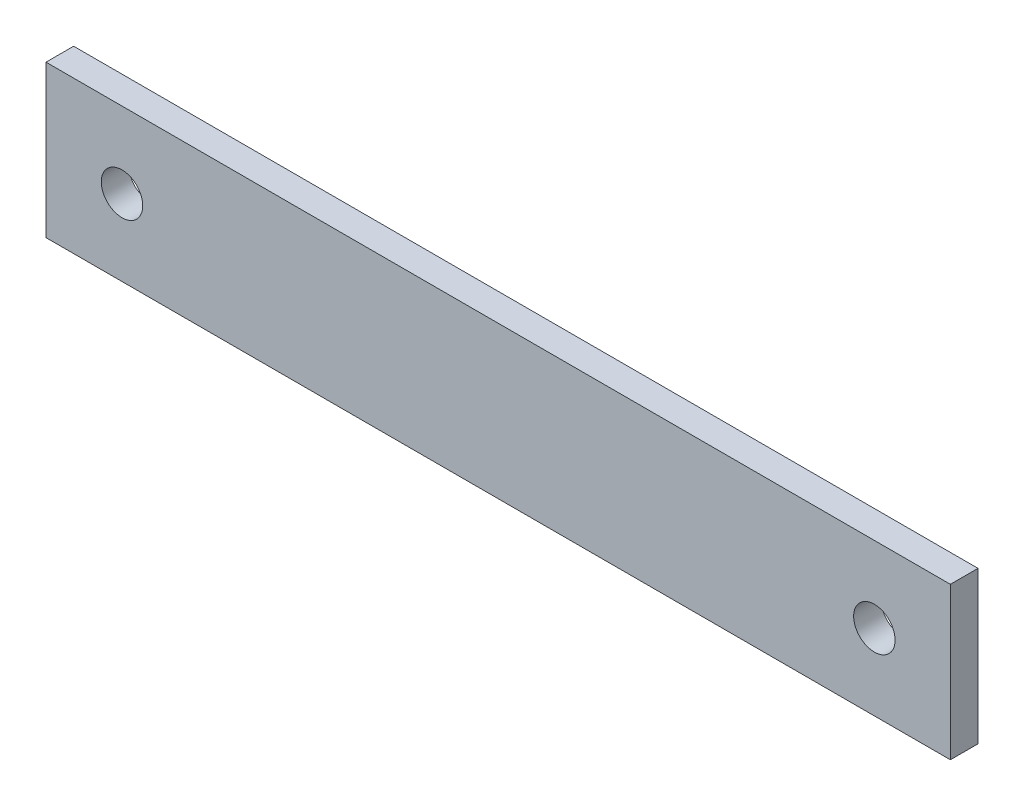
ISO-10303-21;
HEADER;
FILE_DESCRIPTION(('STEP AP214'),'2;1');
FILE_NAME('part.step','',(''),(''),'','','');
FILE_SCHEMA(('AUTOMOTIVE_DESIGN { 1 0 10303 214 1 1 1 1 }'));
ENDSEC;
DATA;
#1=APPLICATION_CONTEXT('core data for automotive mechanical design processes');
#2=APPLICATION_PROTOCOL_DEFINITION('international standard','automotive_design',2000,#1);
#3=PRODUCT_CONTEXT('',#1,'mechanical');
#4=PRODUCT('Part','Part','',(#3));
#5=PRODUCT_RELATED_PRODUCT_CATEGORY('part','',(#4));
#6=PRODUCT_DEFINITION_FORMATION('','',#4);
#7=PRODUCT_DEFINITION_CONTEXT('part definition',#1,'design');
#8=PRODUCT_DEFINITION('design','',#6,#7);
#9=PRODUCT_DEFINITION_SHAPE('','',#8);
#10=(LENGTH_UNIT() NAMED_UNIT(*) SI_UNIT(.MILLI.,.METRE.));
#11=(NAMED_UNIT(*) PLANE_ANGLE_UNIT() SI_UNIT($,.RADIAN.));
#12=(NAMED_UNIT(*) SI_UNIT($,.STERADIAN.) SOLID_ANGLE_UNIT());
#13=UNCERTAINTY_MEASURE_WITH_UNIT(LENGTH_MEASURE(1.E-05),#10,'distance_accuracy_value','');
#14=(GEOMETRIC_REPRESENTATION_CONTEXT(3) GLOBAL_UNCERTAINTY_ASSIGNED_CONTEXT((#13)) GLOBAL_UNIT_ASSIGNED_CONTEXT((#10,
#11,#12)) REPRESENTATION_CONTEXT('',''));
#15=CARTESIAN_POINT('',(0.,0.,0.));
#16=DIRECTION('',(0.,0.,1.));
#17=DIRECTION('',(1.,0.,0.));
#18=AXIS2_PLACEMENT_3D('',#15,#16,#17);
#19=CARTESIAN_POINT('',(0.,0.,2.));
#20=DIRECTION('',(0.,0.,-1.));
#21=DIRECTION('',(-1.,0.,0.));
#22=AXIS2_PLACEMENT_3D('',#19,#20,#21);
#23=PLANE('',#22);
#24=DIRECTION('',(0.,1.,0.));
#25=VECTOR('',#24,1.);
#26=CARTESIAN_POINT('',(119.9,-11.,2.));
#27=LINE('',#26,#25);
#28=CARTESIAN_POINT('',(119.9,-11.,2.));
#29=VERTEX_POINT('',#28);
#30=CARTESIAN_POINT('',(119.9,11.,2.));
#31=VERTEX_POINT('',#30);
#32=EDGE_CURVE('E99',#29,#31,#27,.T.);
#33=ORIENTED_EDGE('',*,*,#32,.T.);
#34=DIRECTION('',(-1.,0.,0.));
#35=VECTOR('',#34,1.);
#36=CARTESIAN_POINT('',(-11.,11.,2.));
#37=LINE('',#36,#35);
#38=CARTESIAN_POINT('',(-11.,11.,2.));
#39=VERTEX_POINT('',#38);
#40=EDGE_CURVE('E92',#31,#39,#37,.T.);
#41=ORIENTED_EDGE('',*,*,#40,.T.);
#42=DIRECTION('',(0.,-1.,0.));
#43=VECTOR('',#42,1.);
#44=CARTESIAN_POINT('',(-11.,-11.,2.));
#45=LINE('',#44,#43);
#46=CARTESIAN_POINT('',(-11.,-11.,2.));
#47=VERTEX_POINT('',#46);
#48=EDGE_CURVE('E98',#39,#47,#45,.T.);
#49=ORIENTED_EDGE('',*,*,#48,.T.);
#50=DIRECTION('',(1.,0.,0.));
#51=VECTOR('',#50,1.);
#52=CARTESIAN_POINT('',(-11.,-11.,2.));
#53=LINE('',#52,#51);
#54=EDGE_CURVE('E63',#47,#29,#53,.T.);
#55=ORIENTED_EDGE('',*,*,#54,.T.);
#56=EDGE_LOOP('',(#33,#41,#49,#55));
#57=FACE_BOUND('',#56,.T.);
#58=CARTESIAN_POINT('',(0.,0.,2.));
#59=DIRECTION('',(0.,0.,1.));
#60=DIRECTION('',(1.,0.,0.));
#61=AXIS2_PLACEMENT_3D('',#58,#59,#60);
#62=CIRCLE('',#61,3.);
#63=CARTESIAN_POINT('',(3.,0.,2.));
#64=VERTEX_POINT('',#63);
#65=EDGE_CURVE('E113',#64,#64,#62,.T.);
#66=ORIENTED_EDGE('',*,*,#65,.F.);
#67=EDGE_LOOP('',(#66));
#68=FACE_BOUND('',#67,.T.);
#69=CARTESIAN_POINT('',(108.9,0.,2.));
#70=DIRECTION('',(0.,0.,1.));
#71=DIRECTION('',(1.,0.,0.));
#72=AXIS2_PLACEMENT_3D('',#69,#70,#71);
#73=CIRCLE('',#72,3.);
#74=CARTESIAN_POINT('',(111.9,0.,2.));
#75=VERTEX_POINT('',#74);
#76=EDGE_CURVE('E128',#75,#75,#73,.T.);
#77=ORIENTED_EDGE('',*,*,#76,.F.);
#78=EDGE_LOOP('',(#77));
#79=FACE_BOUND('',#78,.T.);
#80=ADVANCED_FACE('F50',(#57,#68,#79),#23,.F.);
#81=CARTESIAN_POINT('',(0.,0.,-2.));
#82=DIRECTION('',(0.,0.,-1.));
#83=DIRECTION('',(-1.,0.,0.));
#84=AXIS2_PLACEMENT_3D('',#81,#82,#83);
#85=PLANE('',#84);
#86=CARTESIAN_POINT('',(0.,0.,-2.));
#87=DIRECTION('',(0.,0.,1.));
#88=DIRECTION('',(1.,0.,0.));
#89=AXIS2_PLACEMENT_3D('',#86,#87,#88);
#90=CIRCLE('',#89,3.);
#91=CARTESIAN_POINT('',(3.,0.,-2.));
#92=VERTEX_POINT('',#91);
#93=EDGE_CURVE('E130',#92,#92,#90,.T.);
#94=ORIENTED_EDGE('',*,*,#93,.T.);
#95=EDGE_LOOP('',(#94));
#96=FACE_BOUND('',#95,.T.);
#97=DIRECTION('',(0.,1.,0.));
#98=VECTOR('',#97,1.);
#99=CARTESIAN_POINT('',(119.9,-11.,-2.));
#100=LINE('',#99,#98);
#101=CARTESIAN_POINT('',(119.9,-11.,-2.));
#102=VERTEX_POINT('',#101);
#103=CARTESIAN_POINT('',(119.9,11.,-2.));
#104=VERTEX_POINT('',#103);
#105=EDGE_CURVE('E115',#102,#104,#100,.T.);
#106=ORIENTED_EDGE('',*,*,#105,.F.);
#107=DIRECTION('',(1.,0.,0.));
#108=VECTOR('',#107,1.);
#109=CARTESIAN_POINT('',(-11.,-11.,-2.));
#110=LINE('',#109,#108);
#111=CARTESIAN_POINT('',(-11.,-11.,-2.));
#112=VERTEX_POINT('',#111);
#113=EDGE_CURVE('E86',#112,#102,#110,.T.);
#114=ORIENTED_EDGE('',*,*,#113,.F.);
#115=DIRECTION('',(0.,-1.,0.));
#116=VECTOR('',#115,1.);
#117=CARTESIAN_POINT('',(-11.,-11.,-2.));
#118=LINE('',#117,#116);
#119=CARTESIAN_POINT('',(-11.,11.,-2.));
#120=VERTEX_POINT('',#119);
#121=EDGE_CURVE('E82',#120,#112,#118,.T.);
#122=ORIENTED_EDGE('',*,*,#121,.F.);
#123=DIRECTION('',(-1.,0.,0.));
#124=VECTOR('',#123,1.);
#125=CARTESIAN_POINT('',(-11.,11.,-2.));
#126=LINE('',#125,#124);
#127=EDGE_CURVE('E102',#104,#120,#126,.T.);
#128=ORIENTED_EDGE('',*,*,#127,.F.);
#129=EDGE_LOOP('',(#106,#114,#122,#128));
#130=FACE_BOUND('',#129,.T.);
#131=CARTESIAN_POINT('',(108.9,0.,-2.));
#132=DIRECTION('',(0.,0.,1.));
#133=DIRECTION('',(1.,0.,0.));
#134=AXIS2_PLACEMENT_3D('',#131,#132,#133);
#135=CIRCLE('',#134,3.);
#136=CARTESIAN_POINT('',(111.9,0.,-2.));
#137=VERTEX_POINT('',#136);
#138=EDGE_CURVE('E135',#137,#137,#135,.T.);
#139=ORIENTED_EDGE('',*,*,#138,.T.);
#140=EDGE_LOOP('',(#139));
#141=FACE_BOUND('',#140,.T.);
#142=ADVANCED_FACE('F124',(#96,#130,#141),#85,.T.);
#143=CARTESIAN_POINT('',(119.9,-11.,2.));
#144=DIRECTION('',(-1.,0.,0.));
#145=DIRECTION('',(0.,0.,1.));
#146=AXIS2_PLACEMENT_3D('',#143,#144,#145);
#147=PLANE('',#146);
#148=ORIENTED_EDGE('',*,*,#105,.T.);
#149=DIRECTION('',(0.,0.,-1.));
#150=VECTOR('',#149,1.);
#151=CARTESIAN_POINT('',(119.9,11.,2.));
#152=LINE('',#151,#150);
#153=EDGE_CURVE('E11',#31,#104,#152,.T.);
#154=ORIENTED_EDGE('',*,*,#153,.F.);
#155=ORIENTED_EDGE('',*,*,#32,.F.);
#156=DIRECTION('',(0.,0.,-1.));
#157=VECTOR('',#156,1.);
#158=CARTESIAN_POINT('',(119.9,-11.,2.));
#159=LINE('',#158,#157);
#160=EDGE_CURVE('E107',#29,#102,#159,.T.);
#161=ORIENTED_EDGE('',*,*,#160,.T.);
#162=EDGE_LOOP('',(#148,#154,#155,#161));
#163=FACE_BOUND('',#162,.T.);
#164=ADVANCED_FACE('F49',(#163),#147,.F.);
#165=CARTESIAN_POINT('',(-11.,11.,2.));
#166=DIRECTION('',(0.,-1.,0.));
#167=DIRECTION('',(0.,0.,-1.));
#168=AXIS2_PLACEMENT_3D('',#165,#166,#167);
#169=PLANE('',#168);
#170=ORIENTED_EDGE('',*,*,#127,.T.);
#171=DIRECTION('',(0.,0.,-1.));
#172=VECTOR('',#171,1.);
#173=CARTESIAN_POINT('',(-11.,11.,2.));
#174=LINE('',#173,#172);
#175=EDGE_CURVE('E60',#39,#120,#174,.T.);
#176=ORIENTED_EDGE('',*,*,#175,.F.);
#177=ORIENTED_EDGE('',*,*,#40,.F.);
#178=ORIENTED_EDGE('',*,*,#153,.T.);
#179=EDGE_LOOP('',(#170,#176,#177,#178));
#180=FACE_BOUND('',#179,.T.);
#181=ADVANCED_FACE('F103',(#180),#169,.F.);
#182=CARTESIAN_POINT('',(-11.,-11.,2.));
#183=DIRECTION('',(1.,0.,0.));
#184=DIRECTION('',(0.,0.,-1.));
#185=AXIS2_PLACEMENT_3D('',#182,#183,#184);
#186=PLANE('',#185);
#187=ORIENTED_EDGE('',*,*,#121,.T.);
#188=DIRECTION('',(0.,0.,-1.));
#189=VECTOR('',#188,1.);
#190=CARTESIAN_POINT('',(-11.,-11.,2.));
#191=LINE('',#190,#189);
#192=EDGE_CURVE('E104',#47,#112,#191,.T.);
#193=ORIENTED_EDGE('',*,*,#192,.F.);
#194=ORIENTED_EDGE('',*,*,#48,.F.);
#195=ORIENTED_EDGE('',*,*,#175,.T.);
#196=EDGE_LOOP('',(#187,#193,#194,#195));
#197=FACE_BOUND('',#196,.T.);
#198=ADVANCED_FACE('F106',(#197),#186,.F.);
#199=CARTESIAN_POINT('',(-11.,-11.,2.));
#200=DIRECTION('',(0.,1.,0.));
#201=DIRECTION('',(0.,0.,1.));
#202=AXIS2_PLACEMENT_3D('',#199,#200,#201);
#203=PLANE('',#202);
#204=ORIENTED_EDGE('',*,*,#113,.T.);
#205=ORIENTED_EDGE('',*,*,#160,.F.);
#206=ORIENTED_EDGE('',*,*,#54,.F.);
#207=ORIENTED_EDGE('',*,*,#192,.T.);
#208=EDGE_LOOP('',(#204,#205,#206,#207));
#209=FACE_BOUND('',#208,.T.);
#210=ADVANCED_FACE('F118',(#209),#203,.F.);
#211=CARTESIAN_POINT('',(0.,0.,2.));
#212=DIRECTION('',(0.,0.,-1.));
#213=DIRECTION('',(-1.,0.,0.));
#214=AXIS2_PLACEMENT_3D('',#211,#212,#213);
#215=CYLINDRICAL_SURFACE('',#214,3.);
#216=ORIENTED_EDGE('',*,*,#65,.T.);
#217=EDGE_LOOP('',(#216));
#218=FACE_BOUND('',#217,.T.);
#219=ORIENTED_EDGE('',*,*,#93,.F.);
#220=EDGE_LOOP('',(#219));
#221=FACE_BOUND('',#220,.T.);
#222=ADVANCED_FACE('F153',(#218,#221),#215,.F.);
#223=CARTESIAN_POINT('',(108.9,0.,2.));
#224=DIRECTION('',(0.,0.,-1.));
#225=DIRECTION('',(-1.,0.,0.));
#226=AXIS2_PLACEMENT_3D('',#223,#224,#225);
#227=CYLINDRICAL_SURFACE('',#226,3.);
#228=ORIENTED_EDGE('',*,*,#76,.T.);
#229=EDGE_LOOP('',(#228));
#230=FACE_BOUND('',#229,.T.);
#231=ORIENTED_EDGE('',*,*,#138,.F.);
#232=EDGE_LOOP('',(#231));
#233=FACE_BOUND('',#232,.T.);
#234=ADVANCED_FACE('F138',(#230,#233),#227,.F.);
#235=CLOSED_SHELL('',(#80,#142,#164,#181,#198,#210,#222,#234));
#236=MANIFOLD_SOLID_BREP('B2',#235);
#237=ADVANCED_BREP_SHAPE_REPRESENTATION('',(#18,#236),#14);
#238=SHAPE_DEFINITION_REPRESENTATION(#9,#237);
ENDSEC;
END-ISO-10303-21;
